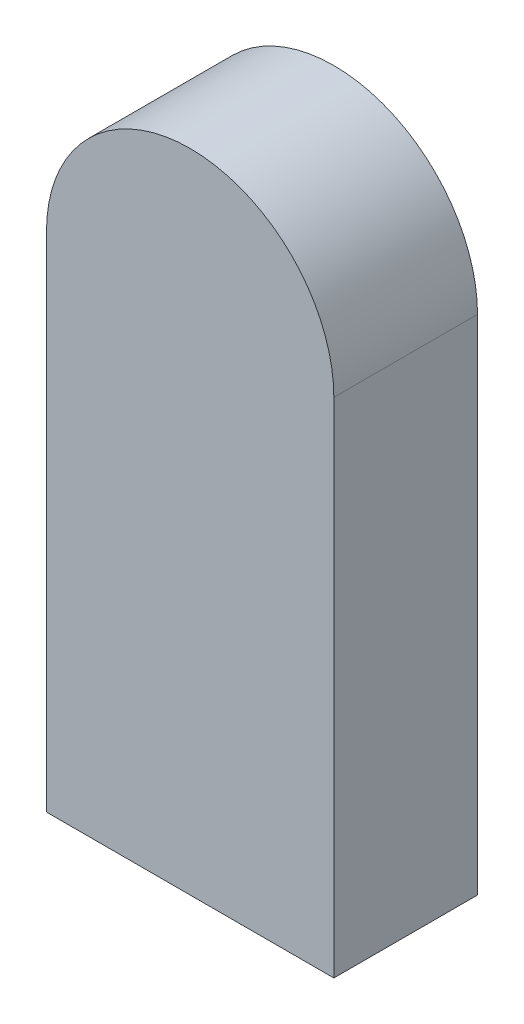
ISO-10303-21;
HEADER;
FILE_DESCRIPTION(('STEP AP214'),'2;1');
FILE_NAME('part.step','',(''),(''),'','','');
FILE_SCHEMA(('AUTOMOTIVE_DESIGN { 1 0 10303 214 1 1 1 1 }'));
ENDSEC;
DATA;
#1=APPLICATION_CONTEXT('core data for automotive mechanical design processes');
#2=APPLICATION_PROTOCOL_DEFINITION('international standard','automotive_design',2000,#1);
#3=PRODUCT_CONTEXT('',#1,'mechanical');
#4=PRODUCT('Part','Part','',(#3));
#5=PRODUCT_RELATED_PRODUCT_CATEGORY('part','',(#4));
#6=PRODUCT_DEFINITION_FORMATION('','',#4);
#7=PRODUCT_DEFINITION_CONTEXT('part definition',#1,'design');
#8=PRODUCT_DEFINITION('design','',#6,#7);
#9=PRODUCT_DEFINITION_SHAPE('','',#8);
#10=(LENGTH_UNIT() NAMED_UNIT(*) SI_UNIT(.MILLI.,.METRE.));
#11=(NAMED_UNIT(*) PLANE_ANGLE_UNIT() SI_UNIT($,.RADIAN.));
#12=(NAMED_UNIT(*) SI_UNIT($,.STERADIAN.) SOLID_ANGLE_UNIT());
#13=UNCERTAINTY_MEASURE_WITH_UNIT(LENGTH_MEASURE(1.E-05),#10,'distance_accuracy_value','');
#14=(GEOMETRIC_REPRESENTATION_CONTEXT(3) GLOBAL_UNCERTAINTY_ASSIGNED_CONTEXT((#13)) GLOBAL_UNIT_ASSIGNED_CONTEXT((#10,
#11,#12)) REPRESENTATION_CONTEXT('',''));
#15=CARTESIAN_POINT('',(0.,0.,0.));
#16=DIRECTION('',(0.,0.,1.));
#17=DIRECTION('',(1.,0.,0.));
#18=AXIS2_PLACEMENT_3D('',#15,#16,#17);
#19=CARTESIAN_POINT('',(0.2,-3.345982909937,0.1));
#20=DIRECTION('',(0.,0.,1.));
#21=DIRECTION('',(1.,0.,0.));
#22=AXIS2_PLACEMENT_3D('',#19,#20,#21);
#23=PLANE('',#22);
#24=CARTESIAN_POINT('',(0.2,-3.2,0.1));
#25=DIRECTION('',(0.,0.,-1.));
#26=DIRECTION('',(-1.,0.,0.));
#27=AXIS2_PLACEMENT_3D('',#24,#25,#26);
#28=CIRCLE('',#27,0.1);
#29=CARTESIAN_POINT('',(0.1,-3.2,0.1));
#30=VERTEX_POINT('',#29);
#31=CARTESIAN_POINT('',(0.3,-3.2,0.1));
#32=VERTEX_POINT('',#31);
#33=EDGE_CURVE('E20',#30,#32,#28,.T.);
#34=ORIENTED_EDGE('',*,*,#33,.F.);
#35=DIRECTION('',(0.,1.,0.));
#36=VECTOR('',#35,1.);
#37=CARTESIAN_POINT('',(0.1,-3.55,0.1));
#38=LINE('',#37,#36);
#39=CARTESIAN_POINT('',(0.1,-3.55,0.1));
#40=VERTEX_POINT('',#39);
#41=EDGE_CURVE('E45',#40,#30,#38,.T.);
#42=ORIENTED_EDGE('',*,*,#41,.F.);
#43=DIRECTION('',(1.,0.,0.));
#44=VECTOR('',#43,1.);
#45=CARTESIAN_POINT('',(0.1,-3.55,0.1));
#46=LINE('',#45,#44);
#47=CARTESIAN_POINT('',(0.3,-3.55,0.1));
#48=VERTEX_POINT('',#47);
#49=EDGE_CURVE('E54',#40,#48,#46,.T.);
#50=ORIENTED_EDGE('',*,*,#49,.T.);
#51=DIRECTION('',(0.,1.,0.));
#52=VECTOR('',#51,1.);
#53=CARTESIAN_POINT('',(0.3,-3.55,0.1));
#54=LINE('',#53,#52);
#55=EDGE_CURVE('E69',#48,#32,#54,.T.);
#56=ORIENTED_EDGE('',*,*,#55,.T.);
#57=EDGE_LOOP('',(#34,#42,#50,#56));
#58=FACE_BOUND('',#57,.T.);
#59=ADVANCED_FACE('F17',(#58),#23,.T.);
#60=CARTESIAN_POINT('',(0.1,-3.55,0.));
#61=DIRECTION('',(0.,1.,0.));
#62=DIRECTION('',(0.,0.,1.));
#63=AXIS2_PLACEMENT_3D('',#60,#61,#62);
#64=PLANE('',#63);
#65=DIRECTION('',(0.,0.,1.));
#66=VECTOR('',#65,1.);
#67=CARTESIAN_POINT('',(0.3,-3.55,0.));
#68=LINE('',#67,#66);
#69=CARTESIAN_POINT('',(0.3,-3.55,0.));
#70=VERTEX_POINT('',#69);
#71=EDGE_CURVE('E63',#70,#48,#68,.T.);
#72=ORIENTED_EDGE('',*,*,#71,.T.);
#73=ORIENTED_EDGE('',*,*,#49,.F.);
#74=DIRECTION('',(0.,0.,1.));
#75=VECTOR('',#74,1.);
#76=CARTESIAN_POINT('',(0.1,-3.55,0.));
#77=LINE('',#76,#75);
#78=CARTESIAN_POINT('',(0.1,-3.55,0.));
#79=VERTEX_POINT('',#78);
#80=EDGE_CURVE('E79',#79,#40,#77,.T.);
#81=ORIENTED_EDGE('',*,*,#80,.F.);
#82=DIRECTION('',(1.,0.,0.));
#83=VECTOR('',#82,1.);
#84=CARTESIAN_POINT('',(0.2,-3.55,0.));
#85=LINE('',#84,#83);
#86=EDGE_CURVE('E75',#79,#70,#85,.T.);
#87=ORIENTED_EDGE('',*,*,#86,.T.);
#88=EDGE_LOOP('',(#72,#73,#81,#87));
#89=FACE_BOUND('',#88,.T.);
#90=ADVANCED_FACE('F78',(#89),#64,.F.);
#91=CARTESIAN_POINT('',(0.3,-3.55,0.));
#92=DIRECTION('',(-1.,0.,0.));
#93=DIRECTION('',(0.,0.,1.));
#94=AXIS2_PLACEMENT_3D('',#91,#92,#93);
#95=PLANE('',#94);
#96=DIRECTION('',(0.,0.,-1.));
#97=VECTOR('',#96,1.);
#98=CARTESIAN_POINT('',(0.3,-3.2,0.));
#99=LINE('',#98,#97);
#100=CARTESIAN_POINT('',(0.3,-3.2,0.));
#101=VERTEX_POINT('',#100);
#102=EDGE_CURVE('E88',#32,#101,#99,.T.);
#103=ORIENTED_EDGE('',*,*,#102,.F.);
#104=ORIENTED_EDGE('',*,*,#55,.F.);
#105=ORIENTED_EDGE('',*,*,#71,.F.);
#106=DIRECTION('',(0.,1.,0.));
#107=VECTOR('',#106,1.);
#108=CARTESIAN_POINT('',(0.3,-3.345982909937,0.));
#109=LINE('',#108,#107);
#110=EDGE_CURVE('E67',#70,#101,#109,.T.);
#111=ORIENTED_EDGE('',*,*,#110,.T.);
#112=EDGE_LOOP('',(#103,#104,#105,#111));
#113=FACE_BOUND('',#112,.T.);
#114=ADVANCED_FACE('F66',(#113),#95,.F.);
#115=CARTESIAN_POINT('',(0.2,-3.2,0.));
#116=DIRECTION('',(0.,0.,-1.));
#117=DIRECTION('',(-1.,0.,0.));
#118=AXIS2_PLACEMENT_3D('',#115,#116,#117);
#119=CYLINDRICAL_SURFACE('',#118,0.1);
#120=ORIENTED_EDGE('',*,*,#33,.T.);
#121=ORIENTED_EDGE('',*,*,#102,.T.);
#122=CARTESIAN_POINT('',(0.2,-3.2,0.));
#123=DIRECTION('',(0.,0.,-1.));
#124=DIRECTION('',(-1.,0.,0.));
#125=AXIS2_PLACEMENT_3D('',#122,#123,#124);
#126=CIRCLE('',#125,0.1);
#127=CARTESIAN_POINT('',(0.1,-3.2,0.));
#128=VERTEX_POINT('',#127);
#129=EDGE_CURVE('E26',#101,#128,#126,.F.);
#130=ORIENTED_EDGE('',*,*,#129,.T.);
#131=DIRECTION('',(0.,0.,1.));
#132=VECTOR('',#131,1.);
#133=CARTESIAN_POINT('',(0.1,-3.2,0.));
#134=LINE('',#133,#132);
#135=EDGE_CURVE('E34',#30,#128,#134,.F.);
#136=ORIENTED_EDGE('',*,*,#135,.F.);
#137=EDGE_LOOP('',(#120,#121,#130,#136));
#138=FACE_BOUND('',#137,.T.);
#139=ADVANCED_FACE('F101',(#138),#119,.T.);
#140=CARTESIAN_POINT('',(0.1,-3.55,0.));
#141=DIRECTION('',(-1.,0.,0.));
#142=DIRECTION('',(0.,0.,1.));
#143=AXIS2_PLACEMENT_3D('',#140,#141,#142);
#144=PLANE('',#143);
#145=ORIENTED_EDGE('',*,*,#135,.T.);
#146=DIRECTION('',(0.,1.,0.));
#147=VECTOR('',#146,1.);
#148=CARTESIAN_POINT('',(0.1,-3.345982909937,0.));
#149=LINE('',#148,#147);
#150=EDGE_CURVE('E11',#128,#79,#149,.F.);
#151=ORIENTED_EDGE('',*,*,#150,.T.);
#152=ORIENTED_EDGE('',*,*,#80,.T.);
#153=ORIENTED_EDGE('',*,*,#41,.T.);
#154=EDGE_LOOP('',(#145,#151,#152,#153));
#155=FACE_BOUND('',#154,.T.);
#156=ADVANCED_FACE('F109',(#155),#144,.T.);
#157=CARTESIAN_POINT('',(0.2,-3.345982909937,0.));
#158=DIRECTION('',(0.,0.,1.));
#159=DIRECTION('',(1.,0.,0.));
#160=AXIS2_PLACEMENT_3D('',#157,#158,#159);
#161=PLANE('',#160);
#162=ORIENTED_EDGE('',*,*,#129,.F.);
#163=ORIENTED_EDGE('',*,*,#110,.F.);
#164=ORIENTED_EDGE('',*,*,#86,.F.);
#165=ORIENTED_EDGE('',*,*,#150,.F.);
#166=EDGE_LOOP('',(#162,#163,#164,#165));
#167=FACE_BOUND('',#166,.T.);
#168=ADVANCED_FACE('F74',(#167),#161,.F.);
#169=CLOSED_SHELL('',(#59,#90,#114,#139,#156,#168));
#170=MANIFOLD_SOLID_BREP('B1',#169);
#171=ADVANCED_BREP_SHAPE_REPRESENTATION('',(#18,#170),#14);
#172=SHAPE_DEFINITION_REPRESENTATION(#9,#171);
ENDSEC;
END-ISO-10303-21;
